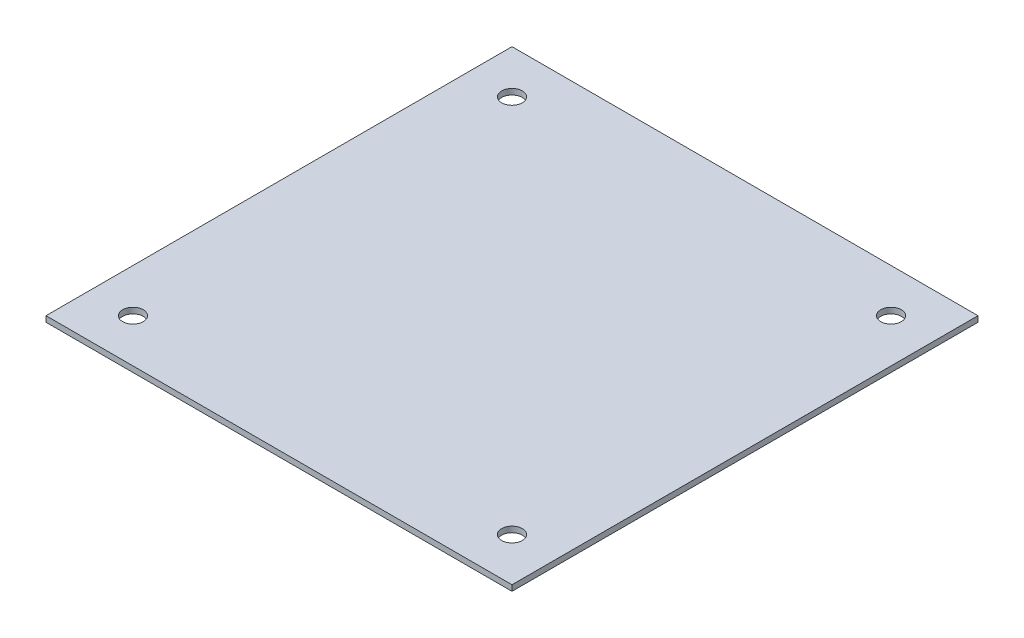
ISO-10303-21;
HEADER;
FILE_DESCRIPTION(('STEP AP214'),'2;1');
FILE_NAME('part.step','',(''),(''),'','','');
FILE_SCHEMA(('AUTOMOTIVE_DESIGN { 1 0 10303 214 1 1 1 1 }'));
ENDSEC;
DATA;
#1=APPLICATION_CONTEXT('core data for automotive mechanical design processes');
#2=APPLICATION_PROTOCOL_DEFINITION('international standard','automotive_design',2000,#1);
#3=PRODUCT_CONTEXT('',#1,'mechanical');
#4=PRODUCT('Part','Part','',(#3));
#5=PRODUCT_RELATED_PRODUCT_CATEGORY('part','',(#4));
#6=PRODUCT_DEFINITION_FORMATION('','',#4);
#7=PRODUCT_DEFINITION_CONTEXT('part definition',#1,'design');
#8=PRODUCT_DEFINITION('design','',#6,#7);
#9=PRODUCT_DEFINITION_SHAPE('','',#8);
#10=(LENGTH_UNIT() NAMED_UNIT(*) SI_UNIT(.MILLI.,.METRE.));
#11=(NAMED_UNIT(*) PLANE_ANGLE_UNIT() SI_UNIT($,.RADIAN.));
#12=(NAMED_UNIT(*) SI_UNIT($,.STERADIAN.) SOLID_ANGLE_UNIT());
#13=UNCERTAINTY_MEASURE_WITH_UNIT(LENGTH_MEASURE(1.E-05),#10,'distance_accuracy_value','');
#14=(GEOMETRIC_REPRESENTATION_CONTEXT(3) GLOBAL_UNCERTAINTY_ASSIGNED_CONTEXT((#13)) GLOBAL_UNIT_ASSIGNED_CONTEXT((#10,
#11,#12)) REPRESENTATION_CONTEXT('',''));
#15=CARTESIAN_POINT('',(0.,0.,0.));
#16=DIRECTION('',(0.,0.,1.));
#17=DIRECTION('',(1.,0.,0.));
#18=AXIS2_PLACEMENT_3D('',#15,#16,#17);
#19=CARTESIAN_POINT('',(0.,-5.,406.4));
#20=DIRECTION('',(0.,1.,0.));
#21=DIRECTION('',(0.,0.,1.));
#22=AXIS2_PLACEMENT_3D('',#19,#20,#21);
#23=PLANE('',#22);
#24=CARTESIAN_POINT('',(37.9150656072227,-5.,368.484934392777));
#25=DIRECTION('',(0.,1.,0.));
#26=DIRECTION('',(0.,0.,1.));
#27=AXIS2_PLACEMENT_3D('',#24,#25,#26);
#28=CIRCLE('',#27,9.00000000000001);
#29=CARTESIAN_POINT('',(37.9150656072227,-5.,377.484934392777));
#30=VERTEX_POINT('',#29);
#31=EDGE_CURVE('E142',#30,#30,#28,.T.);
#32=ORIENTED_EDGE('',*,*,#31,.T.);
#33=EDGE_LOOP('',(#32));
#34=FACE_BOUND('',#33,.T.);
#35=CARTESIAN_POINT('',(368.484934392777,-5.,368.484934392777));
#36=DIRECTION('',(0.,1.,0.));
#37=DIRECTION('',(0.,0.,1.));
#38=AXIS2_PLACEMENT_3D('',#35,#36,#37);
#39=CIRCLE('',#38,8.99999999999999);
#40=CARTESIAN_POINT('',(368.484934392777,-5.,377.484934392777));
#41=VERTEX_POINT('',#40);
#42=EDGE_CURVE('E150',#41,#41,#39,.T.);
#43=ORIENTED_EDGE('',*,*,#42,.T.);
#44=EDGE_LOOP('',(#43));
#45=FACE_BOUND('',#44,.T.);
#46=CARTESIAN_POINT('',(368.484934392777,-5.,37.9150656072227));
#47=DIRECTION('',(0.,1.,0.));
#48=DIRECTION('',(0.,0.,1.));
#49=AXIS2_PLACEMENT_3D('',#46,#47,#48);
#50=CIRCLE('',#49,8.99999999999998);
#51=CARTESIAN_POINT('',(368.484934392777,-5.,46.9150656072227));
#52=VERTEX_POINT('',#51);
#53=EDGE_CURVE('E134',#52,#52,#50,.T.);
#54=ORIENTED_EDGE('',*,*,#53,.T.);
#55=EDGE_LOOP('',(#54));
#56=FACE_BOUND('',#55,.T.);
#57=CARTESIAN_POINT('',(37.9150656072227,-5.,37.9150656072227));
#58=DIRECTION('',(0.,1.,0.));
#59=DIRECTION('',(0.,0.,1.));
#60=AXIS2_PLACEMENT_3D('',#57,#58,#59);
#61=CIRCLE('',#60,9.);
#62=CARTESIAN_POINT('',(37.9150656072227,-5.,46.9150656072227));
#63=VERTEX_POINT('',#62);
#64=EDGE_CURVE('E114',#63,#63,#61,.T.);
#65=ORIENTED_EDGE('',*,*,#64,.T.);
#66=EDGE_LOOP('',(#65));
#67=FACE_BOUND('',#66,.T.);
#68=DIRECTION('',(1.,0.,0.));
#69=VECTOR('',#68,1.);
#70=CARTESIAN_POINT('',(0.,-5.,0.));
#71=LINE('',#70,#69);
#72=CARTESIAN_POINT('',(0.,-5.,0.));
#73=VERTEX_POINT('',#72);
#74=CARTESIAN_POINT('',(406.4,-5.,0.));
#75=VERTEX_POINT('',#74);
#76=EDGE_CURVE('E111',#73,#75,#71,.T.);
#77=ORIENTED_EDGE('',*,*,#76,.T.);
#78=DIRECTION('',(0.,0.,-1.));
#79=VECTOR('',#78,1.);
#80=CARTESIAN_POINT('',(406.4,-5.,406.4));
#81=LINE('',#80,#79);
#82=CARTESIAN_POINT('',(406.4,-5.,406.4));
#83=VERTEX_POINT('',#82);
#84=EDGE_CURVE('E11',#83,#75,#81,.T.);
#85=ORIENTED_EDGE('',*,*,#84,.F.);
#86=DIRECTION('',(1.,0.,0.));
#87=VECTOR('',#86,1.);
#88=CARTESIAN_POINT('',(0.,-5.,406.4));
#89=LINE('',#88,#87);
#90=CARTESIAN_POINT('',(0.,-5.,406.4));
#91=VERTEX_POINT('',#90);
#92=EDGE_CURVE('E85',#91,#83,#89,.T.);
#93=ORIENTED_EDGE('',*,*,#92,.F.);
#94=DIRECTION('',(0.,0.,-1.));
#95=VECTOR('',#94,1.);
#96=CARTESIAN_POINT('',(0.,-5.,406.4));
#97=LINE('',#96,#95);
#98=EDGE_CURVE('E61',#91,#73,#97,.T.);
#99=ORIENTED_EDGE('',*,*,#98,.T.);
#100=EDGE_LOOP('',(#77,#85,#93,#99));
#101=FACE_BOUND('',#100,.T.);
#102=ADVANCED_FACE('F43',(#34,#45,#56,#67,#101),#23,.F.);
#103=CARTESIAN_POINT('',(406.4,0.,406.4));
#104=DIRECTION('',(1.,0.,0.));
#105=DIRECTION('',(0.,0.,-1.));
#106=AXIS2_PLACEMENT_3D('',#103,#104,#105);
#107=PLANE('',#106);
#108=DIRECTION('',(0.,-1.,0.));
#109=VECTOR('',#108,1.);
#110=CARTESIAN_POINT('',(406.4,0.,0.));
#111=LINE('',#110,#109);
#112=CARTESIAN_POINT('',(406.4,0.,0.));
#113=VERTEX_POINT('',#112);
#114=EDGE_CURVE('E94',#113,#75,#111,.T.);
#115=ORIENTED_EDGE('',*,*,#114,.F.);
#116=DIRECTION('',(0.,0.,-1.));
#117=VECTOR('',#116,1.);
#118=CARTESIAN_POINT('',(406.4,0.,406.4));
#119=LINE('',#118,#117);
#120=CARTESIAN_POINT('',(406.4,0.,406.4));
#121=VERTEX_POINT('',#120);
#122=EDGE_CURVE('E53',#121,#113,#119,.T.);
#123=ORIENTED_EDGE('',*,*,#122,.F.);
#124=DIRECTION('',(0.,-1.,0.));
#125=VECTOR('',#124,1.);
#126=CARTESIAN_POINT('',(406.4,0.,406.4));
#127=LINE('',#126,#125);
#128=EDGE_CURVE('E92',#121,#83,#127,.T.);
#129=ORIENTED_EDGE('',*,*,#128,.T.);
#130=ORIENTED_EDGE('',*,*,#84,.T.);
#131=EDGE_LOOP('',(#115,#123,#129,#130));
#132=FACE_BOUND('',#131,.T.);
#133=ADVANCED_FACE('F91',(#132),#107,.T.);
#134=CARTESIAN_POINT('',(0.,0.,406.4));
#135=DIRECTION('',(0.,1.,0.));
#136=DIRECTION('',(0.,0.,1.));
#137=AXIS2_PLACEMENT_3D('',#134,#135,#136);
#138=PLANE('',#137);
#139=CARTESIAN_POINT('',(37.9150656072227,0.,368.484934392777));
#140=DIRECTION('',(0.,1.,0.));
#141=DIRECTION('',(0.,0.,1.));
#142=AXIS2_PLACEMENT_3D('',#139,#140,#141);
#143=CIRCLE('',#142,9.00000000000001);
#144=CARTESIAN_POINT('',(37.9150656072227,0.,377.484934392777));
#145=VERTEX_POINT('',#144);
#146=EDGE_CURVE('E138',#145,#145,#143,.T.);
#147=ORIENTED_EDGE('',*,*,#146,.F.);
#148=EDGE_LOOP('',(#147));
#149=FACE_BOUND('',#148,.T.);
#150=CARTESIAN_POINT('',(368.484934392777,0.,368.484934392777));
#151=DIRECTION('',(0.,1.,0.));
#152=DIRECTION('',(0.,0.,1.));
#153=AXIS2_PLACEMENT_3D('',#150,#151,#152);
#154=CIRCLE('',#153,8.99999999999999);
#155=CARTESIAN_POINT('',(368.484934392777,0.,377.484934392777));
#156=VERTEX_POINT('',#155);
#157=EDGE_CURVE('E146',#156,#156,#154,.T.);
#158=ORIENTED_EDGE('',*,*,#157,.F.);
#159=EDGE_LOOP('',(#158));
#160=FACE_BOUND('',#159,.T.);
#161=CARTESIAN_POINT('',(368.484934392777,0.,37.9150656072227));
#162=DIRECTION('',(0.,1.,0.));
#163=DIRECTION('',(0.,0.,1.));
#164=AXIS2_PLACEMENT_3D('',#161,#162,#163);
#165=CIRCLE('',#164,8.99999999999998);
#166=CARTESIAN_POINT('',(368.484934392777,0.,46.9150656072227));
#167=VERTEX_POINT('',#166);
#168=EDGE_CURVE('E154',#167,#167,#165,.T.);
#169=ORIENTED_EDGE('',*,*,#168,.F.);
#170=EDGE_LOOP('',(#169));
#171=FACE_BOUND('',#170,.T.);
#172=CARTESIAN_POINT('',(37.9150656072227,0.,37.9150656072227));
#173=DIRECTION('',(0.,1.,0.));
#174=DIRECTION('',(0.,0.,1.));
#175=AXIS2_PLACEMENT_3D('',#172,#173,#174);
#176=CIRCLE('',#175,9.);
#177=CARTESIAN_POINT('',(37.9150656072227,0.,46.9150656072227));
#178=VERTEX_POINT('',#177);
#179=EDGE_CURVE('E130',#178,#178,#176,.T.);
#180=ORIENTED_EDGE('',*,*,#179,.F.);
#181=EDGE_LOOP('',(#180));
#182=FACE_BOUND('',#181,.T.);
#183=DIRECTION('',(1.,0.,0.));
#184=VECTOR('',#183,1.);
#185=CARTESIAN_POINT('',(0.,0.,0.));
#186=LINE('',#185,#184);
#187=CARTESIAN_POINT('',(0.,0.,0.));
#188=VERTEX_POINT('',#187);
#189=EDGE_CURVE('E117',#188,#113,#186,.T.);
#190=ORIENTED_EDGE('',*,*,#189,.F.);
#191=DIRECTION('',(0.,0.,-1.));
#192=VECTOR('',#191,1.);
#193=CARTESIAN_POINT('',(0.,0.,406.4));
#194=LINE('',#193,#192);
#195=CARTESIAN_POINT('',(0.,0.,406.4));
#196=VERTEX_POINT('',#195);
#197=EDGE_CURVE('E74',#196,#188,#194,.T.);
#198=ORIENTED_EDGE('',*,*,#197,.F.);
#199=DIRECTION('',(1.,0.,0.));
#200=VECTOR('',#199,1.);
#201=CARTESIAN_POINT('',(0.,0.,406.4));
#202=LINE('',#201,#200);
#203=EDGE_CURVE('E101',#196,#121,#202,.T.);
#204=ORIENTED_EDGE('',*,*,#203,.T.);
#205=ORIENTED_EDGE('',*,*,#122,.T.);
#206=EDGE_LOOP('',(#190,#198,#204,#205));
#207=FACE_BOUND('',#206,.T.);
#208=ADVANCED_FACE('F45',(#149,#160,#171,#182,#207),#138,.T.);
#209=CARTESIAN_POINT('',(0.,-5.,406.4));
#210=DIRECTION('',(-1.,0.,0.));
#211=DIRECTION('',(0.,0.,1.));
#212=AXIS2_PLACEMENT_3D('',#209,#210,#211);
#213=PLANE('',#212);
#214=DIRECTION('',(0.,1.,0.));
#215=VECTOR('',#214,1.);
#216=CARTESIAN_POINT('',(0.,-5.,0.));
#217=LINE('',#216,#215);
#218=EDGE_CURVE('E120',#73,#188,#217,.T.);
#219=ORIENTED_EDGE('',*,*,#218,.F.);
#220=ORIENTED_EDGE('',*,*,#98,.F.);
#221=DIRECTION('',(0.,1.,0.));
#222=VECTOR('',#221,1.);
#223=CARTESIAN_POINT('',(0.,-5.,406.4));
#224=LINE('',#223,#222);
#225=EDGE_CURVE('E105',#91,#196,#224,.T.);
#226=ORIENTED_EDGE('',*,*,#225,.T.);
#227=ORIENTED_EDGE('',*,*,#197,.T.);
#228=EDGE_LOOP('',(#219,#220,#226,#227));
#229=FACE_BOUND('',#228,.T.);
#230=ADVANCED_FACE('F174',(#229),#213,.T.);
#231=CARTESIAN_POINT('',(0.,0.,406.4));
#232=DIRECTION('',(0.,0.,-1.));
#233=DIRECTION('',(-1.,0.,0.));
#234=AXIS2_PLACEMENT_3D('',#231,#232,#233);
#235=PLANE('',#234);
#236=ORIENTED_EDGE('',*,*,#92,.T.);
#237=ORIENTED_EDGE('',*,*,#128,.F.);
#238=ORIENTED_EDGE('',*,*,#203,.F.);
#239=ORIENTED_EDGE('',*,*,#225,.F.);
#240=EDGE_LOOP('',(#236,#237,#238,#239));
#241=FACE_BOUND('',#240,.T.);
#242=ADVANCED_FACE('F100',(#241),#235,.F.);
#243=CARTESIAN_POINT('',(0.,0.,0.));
#244=DIRECTION('',(0.,0.,-1.));
#245=DIRECTION('',(-1.,0.,0.));
#246=AXIS2_PLACEMENT_3D('',#243,#244,#245);
#247=PLANE('',#246);
#248=ORIENTED_EDGE('',*,*,#76,.F.);
#249=ORIENTED_EDGE('',*,*,#218,.T.);
#250=ORIENTED_EDGE('',*,*,#189,.T.);
#251=ORIENTED_EDGE('',*,*,#114,.T.);
#252=EDGE_LOOP('',(#248,#249,#250,#251));
#253=FACE_BOUND('',#252,.T.);
#254=ADVANCED_FACE('F179',(#253),#247,.T.);
#255=CARTESIAN_POINT('',(37.9150656072227,-5.,37.9150656072227));
#256=DIRECTION('',(0.,1.,0.));
#257=DIRECTION('',(0.,0.,1.));
#258=AXIS2_PLACEMENT_3D('',#255,#256,#257);
#259=CYLINDRICAL_SURFACE('',#258,9.);
#260=ORIENTED_EDGE('',*,*,#64,.F.);
#261=EDGE_LOOP('',(#260));
#262=FACE_BOUND('',#261,.T.);
#263=ORIENTED_EDGE('',*,*,#179,.T.);
#264=EDGE_LOOP('',(#263));
#265=FACE_BOUND('',#264,.T.);
#266=ADVANCED_FACE('F168',(#262,#265),#259,.F.);
#267=CARTESIAN_POINT('',(368.484934392777,-5.,37.9150656072227));
#268=DIRECTION('',(0.,1.,0.));
#269=DIRECTION('',(0.,0.,1.));
#270=AXIS2_PLACEMENT_3D('',#267,#268,#269);
#271=CYLINDRICAL_SURFACE('',#270,8.99999999999998);
#272=ORIENTED_EDGE('',*,*,#53,.F.);
#273=EDGE_LOOP('',(#272));
#274=FACE_BOUND('',#273,.T.);
#275=ORIENTED_EDGE('',*,*,#168,.T.);
#276=EDGE_LOOP('',(#275));
#277=FACE_BOUND('',#276,.T.);
#278=ADVANCED_FACE('F164',(#274,#277),#271,.F.);
#279=CARTESIAN_POINT('',(368.484934392777,-5.,368.484934392777));
#280=DIRECTION('',(0.,1.,0.));
#281=DIRECTION('',(0.,0.,1.));
#282=AXIS2_PLACEMENT_3D('',#279,#280,#281);
#283=CYLINDRICAL_SURFACE('',#282,8.99999999999999);
#284=ORIENTED_EDGE('',*,*,#42,.F.);
#285=EDGE_LOOP('',(#284));
#286=FACE_BOUND('',#285,.T.);
#287=ORIENTED_EDGE('',*,*,#157,.T.);
#288=EDGE_LOOP('',(#287));
#289=FACE_BOUND('',#288,.T.);
#290=ADVANCED_FACE('F167',(#286,#289),#283,.F.);
#291=CARTESIAN_POINT('',(37.9150656072227,-5.,368.484934392777));
#292=DIRECTION('',(0.,1.,0.));
#293=DIRECTION('',(0.,0.,1.));
#294=AXIS2_PLACEMENT_3D('',#291,#292,#293);
#295=CYLINDRICAL_SURFACE('',#294,9.00000000000001);
#296=ORIENTED_EDGE('',*,*,#31,.F.);
#297=EDGE_LOOP('',(#296));
#298=FACE_BOUND('',#297,.T.);
#299=ORIENTED_EDGE('',*,*,#146,.T.);
#300=EDGE_LOOP('',(#299));
#301=FACE_BOUND('',#300,.T.);
#302=ADVANCED_FACE('F239',(#298,#301),#295,.F.);
#303=CLOSED_SHELL('',(#102,#133,#208,#230,#242,#254,#266,#278,#290,#302));
#304=MANIFOLD_SOLID_BREP('B2',#303);
#305=ADVANCED_BREP_SHAPE_REPRESENTATION('',(#18,#304),#14);
#306=SHAPE_DEFINITION_REPRESENTATION(#9,#305);
ENDSEC;
END-ISO-10303-21;
